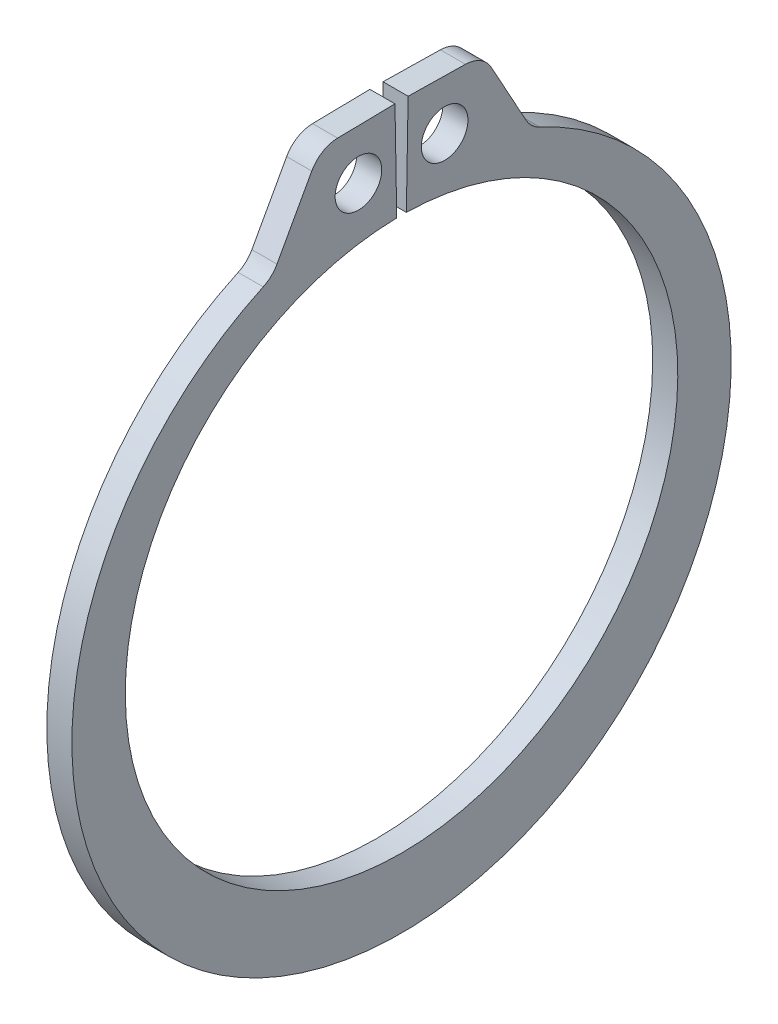
ISO-10303-21;
HEADER;
FILE_DESCRIPTION(('STEP AP214'),'2;1');
FILE_NAME('part.step','',(''),(''),'','','');
FILE_SCHEMA(('AUTOMOTIVE_DESIGN { 1 0 10303 214 1 1 1 1 }'));
ENDSEC;
DATA;
#1=APPLICATION_CONTEXT('core data for automotive mechanical design processes');
#2=APPLICATION_PROTOCOL_DEFINITION('international standard','automotive_design',2000,#1);
#3=PRODUCT_CONTEXT('',#1,'mechanical');
#4=PRODUCT('Part','Part','',(#3));
#5=PRODUCT_RELATED_PRODUCT_CATEGORY('part','',(#4));
#6=PRODUCT_DEFINITION_FORMATION('','',#4);
#7=PRODUCT_DEFINITION_CONTEXT('part definition',#1,'design');
#8=PRODUCT_DEFINITION('design','',#6,#7);
#9=PRODUCT_DEFINITION_SHAPE('','',#8);
#10=(LENGTH_UNIT() NAMED_UNIT(*) SI_UNIT(.MILLI.,.METRE.));
#11=(NAMED_UNIT(*) PLANE_ANGLE_UNIT() SI_UNIT($,.RADIAN.));
#12=(NAMED_UNIT(*) SI_UNIT($,.STERADIAN.) SOLID_ANGLE_UNIT());
#13=UNCERTAINTY_MEASURE_WITH_UNIT(LENGTH_MEASURE(1.E-05),#10,'distance_accuracy_value','');
#14=(GEOMETRIC_REPRESENTATION_CONTEXT(3) GLOBAL_UNCERTAINTY_ASSIGNED_CONTEXT((#13)) GLOBAL_UNIT_ASSIGNED_CONTEXT((#10,
#11,#12)) REPRESENTATION_CONTEXT('',''));
#15=CARTESIAN_POINT('',(0.,0.,0.));
#16=DIRECTION('',(0.,0.,1.));
#17=DIRECTION('',(1.,0.,0.));
#18=AXIS2_PLACEMENT_3D('',#15,#16,#17);
#19=CARTESIAN_POINT('',(0.5334,14.661807341656,2.69451223171899));
#20=DIRECTION('',(-1.,0.,0.));
#21=DIRECTION('',(0.,0.,1.));
#22=AXIS2_PLACEMENT_3D('',#19,#20,#21);
#23=CYLINDRICAL_SURFACE('',#22,1.2827);
#24=CARTESIAN_POINT('',(-0.5334,14.661807341656,2.69451223171899));
#25=DIRECTION('',(-1.,0.,0.));
#26=DIRECTION('',(0.,0.,1.));
#27=AXIS2_PLACEMENT_3D('',#24,#25,#26);
#28=CIRCLE('',#27,1.2827);
#29=CARTESIAN_POINT('',(-0.5334,15.2803079489985,3.81824542457083));
#30=VERTEX_POINT('',#29);
#31=CARTESIAN_POINT('',(-0.5334,15.9443119802331,2.71689843345609));
#32=VERTEX_POINT('',#31);
#33=EDGE_CURVE('E154',#30,#32,#28,.T.);
#34=ORIENTED_EDGE('',*,*,#33,.F.);
#35=DIRECTION('',(-1.,0.,0.));
#36=VECTOR('',#35,1.);
#37=CARTESIAN_POINT('',(0.5334,15.2803079489985,3.81824542457083));
#38=LINE('',#37,#36);
#39=CARTESIAN_POINT('',(0.5334,15.2803079489985,3.81824542457083));
#40=VERTEX_POINT('',#39);
#41=EDGE_CURVE('E11',#40,#30,#38,.T.);
#42=ORIENTED_EDGE('',*,*,#41,.F.);
#43=CARTESIAN_POINT('',(0.5334,14.661807341656,2.69451223171899));
#44=DIRECTION('',(-1.,0.,0.));
#45=DIRECTION('',(0.,0.,1.));
#46=AXIS2_PLACEMENT_3D('',#43,#44,#45);
#47=CIRCLE('',#46,1.2827);
#48=CARTESIAN_POINT('',(0.5334,15.9443119802331,2.71689843345609));
#49=VERTEX_POINT('',#48);
#50=EDGE_CURVE('E187',#40,#49,#47,.T.);
#51=ORIENTED_EDGE('',*,*,#50,.T.);
#52=DIRECTION('',(-1.,0.,0.));
#53=VECTOR('',#52,1.);
#54=CARTESIAN_POINT('',(0.5334,15.9443119802331,2.71689843345609));
#55=LINE('',#54,#53);
#56=EDGE_CURVE('E36',#49,#32,#55,.T.);
#57=ORIENTED_EDGE('',*,*,#56,.T.);
#58=EDGE_LOOP('',(#34,#42,#51,#57));
#59=FACE_BOUND('',#58,.T.);
#60=ADVANCED_FACE('F33',(#59),#23,.T.);
#61=CARTESIAN_POINT('',(0.5334,12.5932417303443,5.29720154936886));
#62=DIRECTION('',(0.,0.482186487364529,0.876068599712977));
#63=DIRECTION('',(0.,-0.876068599712977,0.48218648736453));
#64=AXIS2_PLACEMENT_3D('',#61,#62,#63);
#65=PLANE('',#64);
#66=DIRECTION('',(0.,0.876068599712977,-0.48218648736453));
#67=VECTOR('',#66,1.);
#68=CARTESIAN_POINT('',(-0.5334,12.5932417303443,5.29720154936886));
#69=LINE('',#68,#67);
#70=CARTESIAN_POINT('',(-0.5334,12.5932417303443,5.29720154936886));
#71=VERTEX_POINT('',#70);
#72=EDGE_CURVE('E185',#71,#30,#69,.T.);
#73=ORIENTED_EDGE('',*,*,#72,.F.);
#74=DIRECTION('',(-1.,0.,0.));
#75=VECTOR('',#74,1.);
#76=CARTESIAN_POINT('',(0.5334,12.5932417303443,5.29720154936886));
#77=LINE('',#76,#75);
#78=CARTESIAN_POINT('',(0.5334,12.5932417303443,5.29720154936886));
#79=VERTEX_POINT('',#78);
#80=EDGE_CURVE('E42',#79,#71,#77,.T.);
#81=ORIENTED_EDGE('',*,*,#80,.F.);
#82=DIRECTION('',(0.,0.876068599712977,-0.48218648736453));
#83=VECTOR('',#82,1.);
#84=CARTESIAN_POINT('',(0.5334,12.5932417303443,5.29720154936886));
#85=LINE('',#84,#83);
#86=EDGE_CURVE('E144',#79,#40,#85,.T.);
#87=ORIENTED_EDGE('',*,*,#86,.T.);
#88=ORIENTED_EDGE('',*,*,#41,.T.);
#89=EDGE_LOOP('',(#73,#81,#87,#88));
#90=FACE_BOUND('',#89,.T.);
#91=ADVANCED_FACE('F207',(#90),#65,.T.);
#92=CARTESIAN_POINT('',(0.5334,13.2117423376868,6.4209347422207));
#93=DIRECTION('',(-1.,0.,0.));
#94=DIRECTION('',(0.,0.,1.));
#95=AXIS2_PLACEMENT_3D('',#92,#93,#94);
#96=CYLINDRICAL_SURFACE('',#95,1.2827);
#97=CARTESIAN_POINT('',(-0.5334,13.2117423376868,6.4209347422207));
#98=DIRECTION('',(1.,0.,0.));
#99=DIRECTION('',(0.,0.,-1.));
#100=AXIS2_PLACEMENT_3D('',#97,#98,#99);
#101=CIRCLE('',#100,1.2827);
#102=CARTESIAN_POINT('',(-0.5334,12.0474579195929,5.88264013535209));
#103=VERTEX_POINT('',#102);
#104=EDGE_CURVE('E131',#103,#71,#101,.T.);
#105=ORIENTED_EDGE('',*,*,#104,.F.);
#106=DIRECTION('',(-1.,0.,0.));
#107=VECTOR('',#106,1.);
#108=CARTESIAN_POINT('',(0.5334,12.0474579195929,5.88264013535209));
#109=LINE('',#108,#107);
#110=CARTESIAN_POINT('',(0.5334,12.0474579195929,5.88264013535209));
#111=VERTEX_POINT('',#110);
#112=EDGE_CURVE('E126',#111,#103,#109,.T.);
#113=ORIENTED_EDGE('',*,*,#112,.F.);
#114=CARTESIAN_POINT('',(0.5334,13.2117423376868,6.4209347422207));
#115=DIRECTION('',(1.,0.,0.));
#116=DIRECTION('',(0.,0.,-1.));
#117=AXIS2_PLACEMENT_3D('',#114,#115,#116);
#118=CIRCLE('',#117,1.2827);
#119=EDGE_CURVE('E129',#111,#79,#118,.T.);
#120=ORIENTED_EDGE('',*,*,#119,.T.);
#121=ORIENTED_EDGE('',*,*,#80,.T.);
#122=EDGE_LOOP('',(#105,#113,#120,#121));
#123=FACE_BOUND('',#122,.T.);
#124=ADVANCED_FACE('F128',(#123),#96,.F.);
#125=CARTESIAN_POINT('',(0.5334,-0.676181068147741,0.));
#126=DIRECTION('',(-1.,0.,0.));
#127=DIRECTION('',(0.,0.,1.));
#128=AXIS2_PLACEMENT_3D('',#125,#126,#127);
#129=CYLINDRICAL_SURFACE('',#128,14.0177189318523);
#130=CARTESIAN_POINT('',(-0.5334,-0.676181068147741,0.));
#131=DIRECTION('',(-1.,0.,0.));
#132=DIRECTION('',(0.,0.,1.));
#133=AXIS2_PLACEMENT_3D('',#130,#131,#132);
#134=CIRCLE('',#133,14.0177189318523);
#135=CARTESIAN_POINT('',(-0.5334,12.0474579195929,-5.88264013535209));
#136=VERTEX_POINT('',#135);
#137=EDGE_CURVE('E182',#136,#103,#134,.T.);
#138=ORIENTED_EDGE('',*,*,#137,.F.);
#139=DIRECTION('',(-1.,0.,0.));
#140=VECTOR('',#139,1.);
#141=CARTESIAN_POINT('',(0.5334,12.0474579195929,-5.88264013535209));
#142=LINE('',#141,#140);
#143=CARTESIAN_POINT('',(0.5334,12.0474579195929,-5.88264013535209));
#144=VERTEX_POINT('',#143);
#145=EDGE_CURVE('E136',#144,#136,#142,.T.);
#146=ORIENTED_EDGE('',*,*,#145,.F.);
#147=CARTESIAN_POINT('',(0.5334,-0.676181068147741,0.));
#148=DIRECTION('',(-1.,0.,0.));
#149=DIRECTION('',(0.,0.,1.));
#150=AXIS2_PLACEMENT_3D('',#147,#148,#149);
#151=CIRCLE('',#150,14.0177189318523);
#152=EDGE_CURVE('E142',#144,#111,#151,.T.);
#153=ORIENTED_EDGE('',*,*,#152,.T.);
#154=ORIENTED_EDGE('',*,*,#112,.T.);
#155=EDGE_LOOP('',(#138,#146,#153,#154));
#156=FACE_BOUND('',#155,.T.);
#157=ADVANCED_FACE('F146',(#156),#129,.T.);
#158=CARTESIAN_POINT('',(0.5334,13.2117423376868,-6.4209347422207));
#159=DIRECTION('',(-1.,0.,0.));
#160=DIRECTION('',(0.,0.,1.));
#161=AXIS2_PLACEMENT_3D('',#158,#159,#160);
#162=CYLINDRICAL_SURFACE('',#161,1.2827);
#163=CARTESIAN_POINT('',(-0.5334,13.2117423376868,-6.4209347422207));
#164=DIRECTION('',(1.,0.,0.));
#165=DIRECTION('',(0.,0.,-1.));
#166=AXIS2_PLACEMENT_3D('',#163,#164,#165);
#167=CIRCLE('',#166,1.2827);
#168=CARTESIAN_POINT('',(-0.5334,12.5932417303443,-5.29720154936886));
#169=VERTEX_POINT('',#168);
#170=EDGE_CURVE('E179',#169,#136,#167,.T.);
#171=ORIENTED_EDGE('',*,*,#170,.F.);
#172=DIRECTION('',(-1.,0.,0.));
#173=VECTOR('',#172,1.);
#174=CARTESIAN_POINT('',(0.5334,12.5932417303443,-5.29720154936886));
#175=LINE('',#174,#173);
#176=CARTESIAN_POINT('',(0.5334,12.5932417303443,-5.29720154936886));
#177=VERTEX_POINT('',#176);
#178=EDGE_CURVE('E191',#177,#169,#175,.T.);
#179=ORIENTED_EDGE('',*,*,#178,.F.);
#180=CARTESIAN_POINT('',(0.5334,13.2117423376868,-6.4209347422207));
#181=DIRECTION('',(1.,0.,0.));
#182=DIRECTION('',(0.,0.,-1.));
#183=AXIS2_PLACEMENT_3D('',#180,#181,#182);
#184=CIRCLE('',#183,1.2827);
#185=EDGE_CURVE('E147',#177,#144,#184,.T.);
#186=ORIENTED_EDGE('',*,*,#185,.T.);
#187=ORIENTED_EDGE('',*,*,#145,.T.);
#188=EDGE_LOOP('',(#171,#179,#186,#187));
#189=FACE_BOUND('',#188,.T.);
#190=ADVANCED_FACE('F220',(#189),#162,.F.);
#191=CARTESIAN_POINT('',(0.5334,15.2803079489985,-3.81824542457083));
#192=DIRECTION('',(0.,0.482186487364529,-0.876068599712977));
#193=DIRECTION('',(0.,0.876068599712977,0.482186487364529));
#194=AXIS2_PLACEMENT_3D('',#191,#192,#193);
#195=PLANE('',#194);
#196=DIRECTION('',(0.,-0.876068599712977,-0.482186487364529));
#197=VECTOR('',#196,1.);
#198=CARTESIAN_POINT('',(-0.5334,15.2803079489985,-3.81824542457083));
#199=LINE('',#198,#197);
#200=CARTESIAN_POINT('',(-0.5334,15.2803079489985,-3.81824542457083));
#201=VERTEX_POINT('',#200);
#202=EDGE_CURVE('E176',#201,#169,#199,.T.);
#203=ORIENTED_EDGE('',*,*,#202,.F.);
#204=DIRECTION('',(-1.,0.,0.));
#205=VECTOR('',#204,1.);
#206=CARTESIAN_POINT('',(0.5334,15.2803079489985,-3.81824542457083));
#207=LINE('',#206,#205);
#208=CARTESIAN_POINT('',(0.5334,15.2803079489985,-3.81824542457083));
#209=VERTEX_POINT('',#208);
#210=EDGE_CURVE('E193',#209,#201,#207,.T.);
#211=ORIENTED_EDGE('',*,*,#210,.F.);
#212=DIRECTION('',(0.,-0.876068599712977,-0.482186487364529));
#213=VECTOR('',#212,1.);
#214=CARTESIAN_POINT('',(0.5334,15.2803079489985,-3.81824542457083));
#215=LINE('',#214,#213);
#216=EDGE_CURVE('E149',#209,#177,#215,.T.);
#217=ORIENTED_EDGE('',*,*,#216,.T.);
#218=ORIENTED_EDGE('',*,*,#178,.T.);
#219=EDGE_LOOP('',(#203,#211,#217,#218));
#220=FACE_BOUND('',#219,.T.);
#221=ADVANCED_FACE('F223',(#220),#195,.T.);
#222=CARTESIAN_POINT('',(0.5334,14.661807341656,-2.69451223171899));
#223=DIRECTION('',(-1.,0.,0.));
#224=DIRECTION('',(0.,0.,1.));
#225=AXIS2_PLACEMENT_3D('',#222,#223,#224);
#226=CYLINDRICAL_SURFACE('',#225,1.2827);
#227=CARTESIAN_POINT('',(-0.5334,14.661807341656,-2.69451223171899));
#228=DIRECTION('',(-1.,0.,0.));
#229=DIRECTION('',(0.,0.,1.));
#230=AXIS2_PLACEMENT_3D('',#227,#228,#229);
#231=CIRCLE('',#230,1.2827);
#232=CARTESIAN_POINT('',(-0.5334,15.9443119802331,-2.71689843345609));
#233=VERTEX_POINT('',#232);
#234=EDGE_CURVE('E173',#233,#201,#231,.T.);
#235=ORIENTED_EDGE('',*,*,#234,.F.);
#236=DIRECTION('',(-1.,0.,0.));
#237=VECTOR('',#236,1.);
#238=CARTESIAN_POINT('',(0.5334,15.9443119802331,-2.71689843345609));
#239=LINE('',#238,#237);
#240=CARTESIAN_POINT('',(0.5334,15.9443119802331,-2.71689843345609));
#241=VERTEX_POINT('',#240);
#242=EDGE_CURVE('E195',#241,#233,#239,.T.);
#243=ORIENTED_EDGE('',*,*,#242,.F.);
#244=CARTESIAN_POINT('',(0.5334,14.661807341656,-2.69451223171899));
#245=DIRECTION('',(-1.,0.,0.));
#246=DIRECTION('',(0.,0.,1.));
#247=AXIS2_PLACEMENT_3D('',#244,#245,#246);
#248=CIRCLE('',#247,1.2827);
#249=EDGE_CURVE('E297',#241,#209,#248,.T.);
#250=ORIENTED_EDGE('',*,*,#249,.T.);
#251=ORIENTED_EDGE('',*,*,#210,.T.);
#252=EDGE_LOOP('',(#235,#243,#250,#251));
#253=FACE_BOUND('',#252,.T.);
#254=ADVANCED_FACE('F227',(#253),#226,.T.);
#255=CARTESIAN_POINT('',(0.5334,15.9868647521641,-0.279051762247657));
#256=DIRECTION('',(0.,0.999847695156391,-0.0174524064372834));
#257=DIRECTION('',(0.,0.0174524064372834,0.999847695156391));
#258=AXIS2_PLACEMENT_3D('',#255,#256,#257);
#259=PLANE('',#258);
#260=DIRECTION('',(0.,-0.0174524064372834,-0.999847695156391));
#261=VECTOR('',#260,1.);
#262=CARTESIAN_POINT('',(-0.5334,15.9868647521641,-0.279051762247657));
#263=LINE('',#262,#261);
#264=CARTESIAN_POINT('',(-0.5334,15.9868647521641,-0.279051762247657));
#265=VERTEX_POINT('',#264);
#266=EDGE_CURVE('E170',#265,#233,#263,.T.);
#267=ORIENTED_EDGE('',*,*,#266,.F.);
#268=DIRECTION('',(-1.,0.,0.));
#269=VECTOR('',#268,1.);
#270=CARTESIAN_POINT('',(0.5334,15.9868647521641,-0.279051762247657));
#271=LINE('',#270,#269);
#272=CARTESIAN_POINT('',(0.5334,15.9868647521641,-0.279051762247657));
#273=VERTEX_POINT('',#272);
#274=EDGE_CURVE('E197',#273,#265,#271,.T.);
#275=ORIENTED_EDGE('',*,*,#274,.F.);
#276=DIRECTION('',(0.,-0.0174524064372834,-0.999847695156391));
#277=VECTOR('',#276,1.);
#278=CARTESIAN_POINT('',(0.5334,15.9868647521641,-0.279051762247657));
#279=LINE('',#278,#277);
#280=EDGE_CURVE('E294',#273,#241,#279,.T.);
#281=ORIENTED_EDGE('',*,*,#280,.T.);
#282=ORIENTED_EDGE('',*,*,#242,.T.);
#283=EDGE_LOOP('',(#267,#275,#281,#282));
#284=FACE_BOUND('',#283,.T.);
#285=ADVANCED_FACE('F231',(#284),#259,.T.);
#286=CARTESIAN_POINT('',(0.5334,11.7457107988497,-0.205022144621988));
#287=DIRECTION('',(0.,0.0174524064372835,0.999847695156391));
#288=DIRECTION('',(0.,-0.999847695156391,0.0174524064372835));
#289=AXIS2_PLACEMENT_3D('',#286,#287,#288);
#290=PLANE('',#289);
#291=DIRECTION('',(0.,0.999847695156391,-0.0174524064372835));
#292=VECTOR('',#291,1.);
#293=CARTESIAN_POINT('',(-0.5334,11.7457107988497,-0.205022144621988));
#294=LINE('',#293,#292);
#295=CARTESIAN_POINT('',(-0.5334,11.7457107988497,-0.205022144621988));
#296=VERTEX_POINT('',#295);
#297=EDGE_CURVE('E167',#296,#265,#294,.T.);
#298=ORIENTED_EDGE('',*,*,#297,.F.);
#299=DIRECTION('',(-1.,0.,0.));
#300=VECTOR('',#299,1.);
#301=CARTESIAN_POINT('',(0.5334,11.7457107988497,-0.205022144621988));
#302=LINE('',#301,#300);
#303=CARTESIAN_POINT('',(0.5334,11.7457107988497,-0.205022144621988));
#304=VERTEX_POINT('',#303);
#305=EDGE_CURVE('E199',#304,#296,#302,.T.);
#306=ORIENTED_EDGE('',*,*,#305,.F.);
#307=DIRECTION('',(0.,0.999847695156391,-0.0174524064372835));
#308=VECTOR('',#307,1.);
#309=CARTESIAN_POINT('',(0.5334,11.7457107988497,-0.205022144621988));
#310=LINE('',#309,#308);
#311=EDGE_CURVE('E291',#304,#273,#310,.T.);
#312=ORIENTED_EDGE('',*,*,#311,.T.);
#313=ORIENTED_EDGE('',*,*,#274,.T.);
#314=EDGE_LOOP('',(#298,#306,#312,#313));
#315=FACE_BOUND('',#314,.T.);
#316=ADVANCED_FACE('F235',(#315),#290,.T.);
#317=CARTESIAN_POINT('',(0.5334,0.,0.));
#318=DIRECTION('',(-1.,0.,0.));
#319=DIRECTION('',(0.,0.,1.));
#320=AXIS2_PLACEMENT_3D('',#317,#318,#319);
#321=CYLINDRICAL_SURFACE('',#320,11.7475);
#322=CARTESIAN_POINT('',(-0.5334,0.,0.));
#323=DIRECTION('',(1.,0.,0.));
#324=DIRECTION('',(0.,0.,-1.));
#325=AXIS2_PLACEMENT_3D('',#322,#323,#324);
#326=CIRCLE('',#325,11.7475);
#327=CARTESIAN_POINT('',(-0.5334,11.7457107988497,0.205022144621988));
#328=VERTEX_POINT('',#327);
#329=EDGE_CURVE('E164',#328,#296,#326,.T.);
#330=ORIENTED_EDGE('',*,*,#329,.F.);
#331=DIRECTION('',(-1.,0.,0.));
#332=VECTOR('',#331,1.);
#333=CARTESIAN_POINT('',(0.5334,11.7457107988497,0.205022144621988));
#334=LINE('',#333,#332);
#335=CARTESIAN_POINT('',(0.5334,11.7457107988497,0.205022144621988));
#336=VERTEX_POINT('',#335);
#337=EDGE_CURVE('E201',#336,#328,#334,.T.);
#338=ORIENTED_EDGE('',*,*,#337,.F.);
#339=CARTESIAN_POINT('',(0.5334,0.,0.));
#340=DIRECTION('',(1.,0.,0.));
#341=DIRECTION('',(0.,0.,-1.));
#342=AXIS2_PLACEMENT_3D('',#339,#340,#341);
#343=CIRCLE('',#342,11.7475);
#344=EDGE_CURVE('E288',#336,#304,#343,.T.);
#345=ORIENTED_EDGE('',*,*,#344,.T.);
#346=ORIENTED_EDGE('',*,*,#305,.T.);
#347=EDGE_LOOP('',(#330,#338,#345,#346));
#348=FACE_BOUND('',#347,.T.);
#349=ADVANCED_FACE('F239',(#348),#321,.F.);
#350=CARTESIAN_POINT('',(0.5334,15.9868647521641,0.279051762247657));
#351=DIRECTION('',(0.,0.0174524064372834,-0.999847695156391));
#352=DIRECTION('',(0.,0.999847695156391,0.0174524064372834));
#353=AXIS2_PLACEMENT_3D('',#350,#351,#352);
#354=PLANE('',#353);
#355=DIRECTION('',(0.,-0.999847695156391,-0.0174524064372834));
#356=VECTOR('',#355,1.);
#357=CARTESIAN_POINT('',(-0.5334,15.9868647521641,0.279051762247657));
#358=LINE('',#357,#356);
#359=CARTESIAN_POINT('',(-0.5334,15.9868647521641,0.279051762247657));
#360=VERTEX_POINT('',#359);
#361=EDGE_CURVE('E161',#360,#328,#358,.T.);
#362=ORIENTED_EDGE('',*,*,#361,.F.);
#363=DIRECTION('',(-1.,0.,0.));
#364=VECTOR('',#363,1.);
#365=CARTESIAN_POINT('',(0.5334,15.9868647521641,0.279051762247657));
#366=LINE('',#365,#364);
#367=CARTESIAN_POINT('',(0.5334,15.9868647521641,0.279051762247657));
#368=VERTEX_POINT('',#367);
#369=EDGE_CURVE('E202',#368,#360,#366,.T.);
#370=ORIENTED_EDGE('',*,*,#369,.F.);
#371=DIRECTION('',(0.,-0.999847695156391,-0.0174524064372834));
#372=VECTOR('',#371,1.);
#373=CARTESIAN_POINT('',(0.5334,15.9868647521641,0.279051762247657));
#374=LINE('',#373,#372);
#375=EDGE_CURVE('E285',#368,#336,#374,.T.);
#376=ORIENTED_EDGE('',*,*,#375,.T.);
#377=ORIENTED_EDGE('',*,*,#337,.T.);
#378=EDGE_LOOP('',(#362,#370,#376,#377));
#379=FACE_BOUND('',#378,.T.);
#380=ADVANCED_FACE('F243',(#379),#354,.T.);
#381=CARTESIAN_POINT('',(0.5334,15.9443119802331,2.71689843345609));
#382=DIRECTION('',(0.,0.999847695156391,0.017452406437282));
#383=DIRECTION('',(0.,-0.017452406437282,0.999847695156391));
#384=AXIS2_PLACEMENT_3D('',#381,#382,#383);
#385=PLANE('',#384);
#386=DIRECTION('',(0.,0.017452406437282,-0.999847695156391));
#387=VECTOR('',#386,1.);
#388=CARTESIAN_POINT('',(-0.5334,15.9443119802331,2.71689843345609));
#389=LINE('',#388,#387);
#390=EDGE_CURVE('E157',#32,#360,#389,.T.);
#391=ORIENTED_EDGE('',*,*,#390,.F.);
#392=ORIENTED_EDGE('',*,*,#56,.F.);
#393=DIRECTION('',(0.,0.017452406437282,-0.999847695156391));
#394=VECTOR('',#393,1.);
#395=CARTESIAN_POINT('',(0.5334,15.9443119802331,2.71689843345609));
#396=LINE('',#395,#394);
#397=EDGE_CURVE('E283',#49,#368,#396,.T.);
#398=ORIENTED_EDGE('',*,*,#397,.T.);
#399=ORIENTED_EDGE('',*,*,#369,.T.);
#400=EDGE_LOOP('',(#391,#392,#398,#399));
#401=FACE_BOUND('',#400,.T.);
#402=ADVANCED_FACE('F204',(#401),#385,.T.);
#403=CARTESIAN_POINT('',(0.5334,14.661807341656,2.69451223171899));
#404=DIRECTION('',(-1.,0.,0.));
#405=DIRECTION('',(0.,0.,1.));
#406=AXIS2_PLACEMENT_3D('',#403,#404,#405);
#407=PLANE('',#406);
#408=CARTESIAN_POINT('',(0.5334,13.8385266688972,1.8324696859277));
#409=DIRECTION('',(-1.,0.,0.));
#410=DIRECTION('',(0.,0.,-1.));
#411=AXIS2_PLACEMENT_3D('',#408,#409,#410);
#412=CIRCLE('',#411,0.9906);
#413=CARTESIAN_POINT('',(0.5334,13.8385266688972,0.841869685927701));
#414=VERTEX_POINT('',#413);
#415=EDGE_CURVE('E270',#414,#414,#412,.T.);
#416=ORIENTED_EDGE('',*,*,#415,.T.);
#417=EDGE_LOOP('',(#416));
#418=FACE_BOUND('',#417,.T.);
#419=CARTESIAN_POINT('',(0.5334,13.8385266688972,-1.8324696859277));
#420=DIRECTION('',(-1.,0.,0.));
#421=DIRECTION('',(0.,0.,-1.));
#422=AXIS2_PLACEMENT_3D('',#419,#420,#421);
#423=CIRCLE('',#422,0.9906);
#424=CARTESIAN_POINT('',(0.5334,13.8385266688972,-2.8230696859277));
#425=VERTEX_POINT('',#424);
#426=EDGE_CURVE('E158',#425,#425,#423,.T.);
#427=ORIENTED_EDGE('',*,*,#426,.T.);
#428=EDGE_LOOP('',(#427));
#429=FACE_BOUND('',#428,.T.);
#430=ORIENTED_EDGE('',*,*,#50,.F.);
#431=ORIENTED_EDGE('',*,*,#86,.F.);
#432=ORIENTED_EDGE('',*,*,#119,.F.);
#433=ORIENTED_EDGE('',*,*,#152,.F.);
#434=ORIENTED_EDGE('',*,*,#185,.F.);
#435=ORIENTED_EDGE('',*,*,#216,.F.);
#436=ORIENTED_EDGE('',*,*,#249,.F.);
#437=ORIENTED_EDGE('',*,*,#280,.F.);
#438=ORIENTED_EDGE('',*,*,#311,.F.);
#439=ORIENTED_EDGE('',*,*,#344,.F.);
#440=ORIENTED_EDGE('',*,*,#375,.F.);
#441=ORIENTED_EDGE('',*,*,#397,.F.);
#442=EDGE_LOOP('',(#430,#431,#432,#433,#434,#435,#436,#437,#438,#439,#440,#441));
#443=FACE_BOUND('',#442,.T.);
#444=ADVANCED_FACE('F140',(#418,#429,#443),#407,.F.);
#445=CARTESIAN_POINT('',(-0.5334,14.661807341656,2.69451223171899));
#446=DIRECTION('',(-1.,0.,0.));
#447=DIRECTION('',(0.,0.,1.));
#448=AXIS2_PLACEMENT_3D('',#445,#446,#447);
#449=PLANE('',#448);
#450=CARTESIAN_POINT('',(-0.5334,13.8385266688972,1.8324696859277));
#451=DIRECTION('',(-1.,0.,0.));
#452=DIRECTION('',(0.,0.,-1.));
#453=AXIS2_PLACEMENT_3D('',#450,#451,#452);
#454=CIRCLE('',#453,0.9906);
#455=CARTESIAN_POINT('',(-0.5334,13.8385266688972,0.841869685927701));
#456=VERTEX_POINT('',#455);
#457=EDGE_CURVE('E273',#456,#456,#454,.T.);
#458=ORIENTED_EDGE('',*,*,#457,.F.);
#459=EDGE_LOOP('',(#458));
#460=FACE_BOUND('',#459,.T.);
#461=CARTESIAN_POINT('',(-0.5334,13.8385266688972,-1.8324696859277));
#462=DIRECTION('',(-1.,0.,0.));
#463=DIRECTION('',(0.,0.,-1.));
#464=AXIS2_PLACEMENT_3D('',#461,#462,#463);
#465=CIRCLE('',#464,0.9906);
#466=CARTESIAN_POINT('',(-0.5334,13.8385266688972,-2.8230696859277));
#467=VERTEX_POINT('',#466);
#468=EDGE_CURVE('E275',#467,#467,#465,.T.);
#469=ORIENTED_EDGE('',*,*,#468,.F.);
#470=EDGE_LOOP('',(#469));
#471=FACE_BOUND('',#470,.T.);
#472=ORIENTED_EDGE('',*,*,#33,.T.);
#473=ORIENTED_EDGE('',*,*,#390,.T.);
#474=ORIENTED_EDGE('',*,*,#361,.T.);
#475=ORIENTED_EDGE('',*,*,#329,.T.);
#476=ORIENTED_EDGE('',*,*,#297,.T.);
#477=ORIENTED_EDGE('',*,*,#266,.T.);
#478=ORIENTED_EDGE('',*,*,#234,.T.);
#479=ORIENTED_EDGE('',*,*,#202,.T.);
#480=ORIENTED_EDGE('',*,*,#170,.T.);
#481=ORIENTED_EDGE('',*,*,#137,.T.);
#482=ORIENTED_EDGE('',*,*,#104,.T.);
#483=ORIENTED_EDGE('',*,*,#72,.T.);
#484=EDGE_LOOP('',(#472,#473,#474,#475,#476,#477,#478,#479,#480,#481,#482,#483));
#485=FACE_BOUND('',#484,.T.);
#486=ADVANCED_FACE('F206',(#460,#471,#485),#449,.T.);
#487=CARTESIAN_POINT('',(0.5334,13.8385266688972,-1.8324696859277));
#488=DIRECTION('',(-1.,0.,0.));
#489=DIRECTION('',(0.,0.,1.));
#490=AXIS2_PLACEMENT_3D('',#487,#488,#489);
#491=CYLINDRICAL_SURFACE('',#490,0.9906);
#492=ORIENTED_EDGE('',*,*,#426,.F.);
#493=EDGE_LOOP('',(#492));
#494=FACE_BOUND('',#493,.T.);
#495=ORIENTED_EDGE('',*,*,#468,.T.);
#496=EDGE_LOOP('',(#495));
#497=FACE_BOUND('',#496,.T.);
#498=ADVANCED_FACE('F255',(#494,#497),#491,.F.);
#499=CARTESIAN_POINT('',(0.5334,13.8385266688972,1.8324696859277));
#500=DIRECTION('',(-1.,0.,0.));
#501=DIRECTION('',(0.,0.,1.));
#502=AXIS2_PLACEMENT_3D('',#499,#500,#501);
#503=CYLINDRICAL_SURFACE('',#502,0.9906);
#504=ORIENTED_EDGE('',*,*,#415,.F.);
#505=EDGE_LOOP('',(#504));
#506=FACE_BOUND('',#505,.T.);
#507=ORIENTED_EDGE('',*,*,#457,.T.);
#508=EDGE_LOOP('',(#507));
#509=FACE_BOUND('',#508,.T.);
#510=ADVANCED_FACE('F262',(#506,#509),#503,.F.);
#511=CLOSED_SHELL('',(#60,#91,#124,#157,#190,#221,#254,#285,#316,#349,#380,#402,#444,#486,#498,#510));
#512=MANIFOLD_SOLID_BREP('B2',#511);
#513=ADVANCED_BREP_SHAPE_REPRESENTATION('',(#18,#512),#14);
#514=SHAPE_DEFINITION_REPRESENTATION(#9,#513);
ENDSEC;
END-ISO-10303-21;
